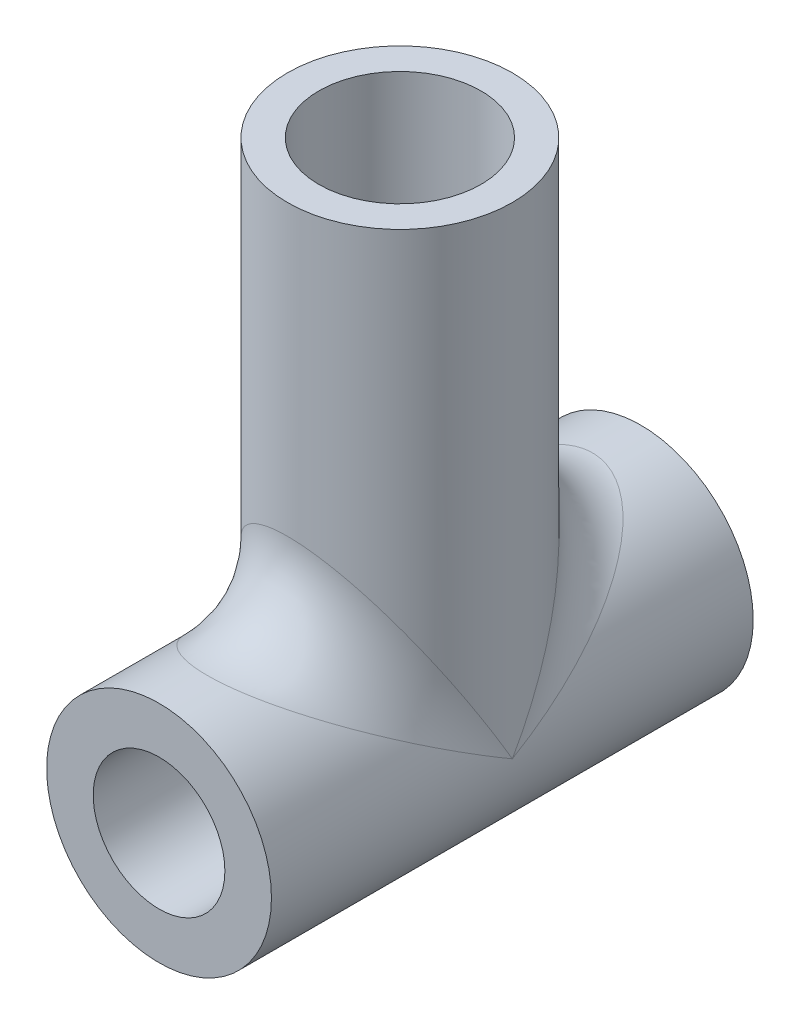
ISO-10303-21;
HEADER;
FILE_DESCRIPTION(('STEP AP214'),'2;1');
FILE_NAME('part.step','',(''),(''),'','','');
FILE_SCHEMA(('AUTOMOTIVE_DESIGN { 1 0 10303 214 1 1 1 1 }'));
ENDSEC;
DATA;
#1=APPLICATION_CONTEXT('core data for automotive mechanical design processes');
#2=APPLICATION_PROTOCOL_DEFINITION('international standard','automotive_design',2000,#1);
#3=PRODUCT_CONTEXT('',#1,'mechanical');
#4=PRODUCT('Part','Part','',(#3));
#5=PRODUCT_RELATED_PRODUCT_CATEGORY('part','',(#4));
#6=PRODUCT_DEFINITION_FORMATION('','',#4);
#7=PRODUCT_DEFINITION_CONTEXT('part definition',#1,'design');
#8=PRODUCT_DEFINITION('design','',#6,#7);
#9=PRODUCT_DEFINITION_SHAPE('','',#8);
#10=(LENGTH_UNIT() NAMED_UNIT(*) SI_UNIT(.MILLI.,.METRE.));
#11=(NAMED_UNIT(*) PLANE_ANGLE_UNIT() SI_UNIT($,.RADIAN.));
#12=(NAMED_UNIT(*) SI_UNIT($,.STERADIAN.) SOLID_ANGLE_UNIT());
#13=UNCERTAINTY_MEASURE_WITH_UNIT(LENGTH_MEASURE(1.E-05),#10,'distance_accuracy_value','');
#14=(GEOMETRIC_REPRESENTATION_CONTEXT(3) GLOBAL_UNCERTAINTY_ASSIGNED_CONTEXT((#13)) GLOBAL_UNIT_ASSIGNED_CONTEXT((#10,
#11,#12)) REPRESENTATION_CONTEXT('',''));
#15=CARTESIAN_POINT('',(0.,0.,0.));
#16=DIRECTION('',(0.,0.,1.));
#17=DIRECTION('',(1.,0.,0.));
#18=AXIS2_PLACEMENT_3D('',#15,#16,#17);
#19=CARTESIAN_POINT('',(0.,0.,30.));
#20=DIRECTION('',(0.,0.,-1.));
#21=DIRECTION('',(-1.,0.,0.));
#22=AXIS2_PLACEMENT_3D('',#19,#20,#21);
#23=CYLINDRICAL_SURFACE('',#22,7.);
#24=CARTESIAN_POINT('',(0.,0.,0.));
#25=DIRECTION('',(0.,0.,1.));
#26=DIRECTION('',(1.,0.,0.));
#27=AXIS2_PLACEMENT_3D('',#24,#25,#26);
#28=CIRCLE('',#27,7.);
#29=CARTESIAN_POINT('',(7.,0.,0.));
#30=VERTEX_POINT('',#29);
#31=EDGE_CURVE('E80',#30,#30,#28,.T.);
#32=ORIENTED_EDGE('',*,*,#31,.T.);
#33=EDGE_LOOP('',(#32));
#34=FACE_BOUND('',#33,.T.);
#35=CARTESIAN_POINT('',(0.,0.,30.));
#36=DIRECTION('',(0.,0.,1.));
#37=DIRECTION('',(1.,0.,0.));
#38=AXIS2_PLACEMENT_3D('',#35,#36,#37);
#39=CIRCLE('',#38,7.);
#40=CARTESIAN_POINT('',(7.,0.,30.));
#41=VERTEX_POINT('',#40);
#42=EDGE_CURVE('E76',#41,#41,#39,.T.);
#43=ORIENTED_EDGE('',*,*,#42,.F.);
#44=EDGE_LOOP('',(#43));
#45=FACE_BOUND('',#44,.T.);
#46=CARTESIAN_POINT('',(0.,0.,15.));
#47=DIRECTION('',(0.,0.863778900898433,0.503871025524086));
#48=DIRECTION('',(0.,-0.503871025524086,0.863778900898433));
#49=AXIS2_PLACEMENT_3D('',#46,#47,#48);
#50=ELLIPSE('',#49,13.8924439894498,7.);
#51=CARTESIAN_POINT('',(-7.,0.,15.));
#52=VERTEX_POINT('',#51);
#53=CARTESIAN_POINT('',(7.,0.,15.));
#54=VERTEX_POINT('',#53);
#55=EDGE_CURVE('E53',#52,#54,#50,.F.);
#56=ORIENTED_EDGE('',*,*,#55,.T.);
#57=CARTESIAN_POINT('',(0.,0.,15.));
#58=DIRECTION('',(0.,0.863778900898433,-0.503871025524086));
#59=DIRECTION('',(0.,-0.503871025524086,-0.863778900898433));
#60=AXIS2_PLACEMENT_3D('',#57,#58,#59);
#61=ELLIPSE('',#60,13.8924439894498,7.);
#62=EDGE_CURVE('E11',#54,#52,#61,.F.);
#63=ORIENTED_EDGE('',*,*,#62,.T.);
#64=EDGE_LOOP('',(#56,#63));
#65=FACE_BOUND('',#64,.T.);
#66=ADVANCED_FACE('F39',(#34,#45,#65),#23,.T.);
#67=CARTESIAN_POINT('',(0.,0.,30.));
#68=DIRECTION('',(0.,0.,1.));
#69=DIRECTION('',(1.,0.,0.));
#70=AXIS2_PLACEMENT_3D('',#67,#68,#69);
#71=PLANE('',#70);
#72=CARTESIAN_POINT('',(0.,0.,30.));
#73=DIRECTION('',(0.,0.,1.));
#74=DIRECTION('',(1.,0.,0.));
#75=AXIS2_PLACEMENT_3D('',#72,#73,#74);
#76=CIRCLE('',#75,4.1);
#77=CARTESIAN_POINT('',(4.1,0.,30.));
#78=VERTEX_POINT('',#77);
#79=EDGE_CURVE('E134',#78,#78,#76,.T.);
#80=ORIENTED_EDGE('',*,*,#79,.F.);
#81=EDGE_LOOP('',(#80));
#82=FACE_BOUND('',#81,.T.);
#83=ORIENTED_EDGE('',*,*,#42,.T.);
#84=EDGE_LOOP('',(#83));
#85=FACE_BOUND('',#84,.T.);
#86=ADVANCED_FACE('F98',(#82,#85),#71,.T.);
#87=CARTESIAN_POINT('',(0.,0.,0.));
#88=DIRECTION('',(0.,0.,1.));
#89=DIRECTION('',(1.,0.,0.));
#90=AXIS2_PLACEMENT_3D('',#87,#88,#89);
#91=PLANE('',#90);
#92=CARTESIAN_POINT('',(0.,0.,0.));
#93=DIRECTION('',(0.,0.,1.));
#94=DIRECTION('',(1.,0.,0.));
#95=AXIS2_PLACEMENT_3D('',#92,#93,#94);
#96=CIRCLE('',#95,4.1);
#97=CARTESIAN_POINT('',(4.1,0.,0.));
#98=VERTEX_POINT('',#97);
#99=EDGE_CURVE('E132',#98,#98,#96,.T.);
#100=ORIENTED_EDGE('',*,*,#99,.T.);
#101=EDGE_LOOP('',(#100));
#102=FACE_BOUND('',#101,.T.);
#103=ORIENTED_EDGE('',*,*,#31,.F.);
#104=EDGE_LOOP('',(#103));
#105=FACE_BOUND('',#104,.T.);
#106=ADVANCED_FACE('F95',(#102,#105),#91,.F.);
#107=CARTESIAN_POINT('',(0.,30.,15.));
#108=DIRECTION('',(0.,-1.,0.));
#109=DIRECTION('',(0.,0.,-1.));
#110=AXIS2_PLACEMENT_3D('',#107,#108,#109);
#111=CYLINDRICAL_SURFACE('',#110,7.);
#112=CARTESIAN_POINT('',(0.,30.,15.));
#113=DIRECTION('',(0.,1.,0.));
#114=DIRECTION('',(0.,0.,1.));
#115=AXIS2_PLACEMENT_3D('',#112,#113,#114);
#116=CIRCLE('',#115,7.);
#117=CARTESIAN_POINT('',(0.,30.,22.));
#118=VERTEX_POINT('',#117);
#119=EDGE_CURVE('E118',#118,#118,#116,.T.);
#120=ORIENTED_EDGE('',*,*,#119,.F.);
#121=EDGE_LOOP('',(#120));
#122=FACE_BOUND('',#121,.T.);
#123=CARTESIAN_POINT('',(0.,0.,15.));
#124=DIRECTION('',(0.,0.503871025524086,0.863778900898433));
#125=DIRECTION('',(0.,-0.863778900898433,0.503871025524086));
#126=AXIS2_PLACEMENT_3D('',#123,#124,#125);
#127=ELLIPSE('',#126,13.8924439894498,7.);
#128=EDGE_CURVE('E72',#54,#52,#127,.T.);
#129=ORIENTED_EDGE('',*,*,#128,.T.);
#130=CARTESIAN_POINT('',(0.,0.,15.));
#131=DIRECTION('',(0.,0.503871025524086,-0.863778900898433));
#132=DIRECTION('',(0.,-0.863778900898433,-0.503871025524086));
#133=AXIS2_PLACEMENT_3D('',#130,#131,#132);
#134=ELLIPSE('',#133,13.8924439894498,7.);
#135=EDGE_CURVE('E65',#52,#54,#134,.T.);
#136=ORIENTED_EDGE('',*,*,#135,.T.);
#137=EDGE_LOOP('',(#129,#136));
#138=FACE_BOUND('',#137,.T.);
#139=ADVANCED_FACE('F71',(#122,#138),#111,.T.);
#140=CARTESIAN_POINT('',(0.,30.,15.));
#141=DIRECTION('',(0.,1.,0.));
#142=DIRECTION('',(0.,0.,1.));
#143=AXIS2_PLACEMENT_3D('',#140,#141,#142);
#144=PLANE('',#143);
#145=CARTESIAN_POINT('',(0.,30.,15.));
#146=DIRECTION('',(0.,1.,0.));
#147=DIRECTION('',(0.,0.,1.));
#148=AXIS2_PLACEMENT_3D('',#145,#146,#147);
#149=CIRCLE('',#148,5.05);
#150=CARTESIAN_POINT('',(0.,30.,20.05));
#151=VERTEX_POINT('',#150);
#152=EDGE_CURVE('E127',#151,#151,#149,.T.);
#153=ORIENTED_EDGE('',*,*,#152,.F.);
#154=EDGE_LOOP('',(#153));
#155=FACE_BOUND('',#154,.T.);
#156=ORIENTED_EDGE('',*,*,#119,.T.);
#157=EDGE_LOOP('',(#156));
#158=FACE_BOUND('',#157,.T.);
#159=ADVANCED_FACE('F94',(#155,#158),#144,.T.);
#160=CARTESIAN_POINT('',(0.,8.,15.));
#161=DIRECTION('',(0.,1.,0.));
#162=DIRECTION('',(0.,0.,1.));
#163=AXIS2_PLACEMENT_3D('',#160,#161,#162);
#164=CYLINDRICAL_SURFACE('',#163,5.05);
#165=CARTESIAN_POINT('',(0.,8.,15.));
#166=DIRECTION('',(0.,1.,0.));
#167=DIRECTION('',(0.,0.,1.));
#168=AXIS2_PLACEMENT_3D('',#165,#166,#167);
#169=CIRCLE('',#168,5.05);
#170=CARTESIAN_POINT('',(0.,8.,20.05));
#171=VERTEX_POINT('',#170);
#172=EDGE_CURVE('E121',#171,#171,#169,.T.);
#173=ORIENTED_EDGE('',*,*,#172,.F.);
#174=EDGE_LOOP('',(#173));
#175=FACE_BOUND('',#174,.T.);
#176=ORIENTED_EDGE('',*,*,#152,.T.);
#177=EDGE_LOOP('',(#176));
#178=FACE_BOUND('',#177,.T.);
#179=ADVANCED_FACE('F149',(#175,#178),#164,.F.);
#180=CARTESIAN_POINT('',(0.,8.,15.));
#181=DIRECTION('',(0.,1.,0.));
#182=DIRECTION('',(0.,0.,1.));
#183=AXIS2_PLACEMENT_3D('',#180,#181,#182);
#184=PLANE('',#183);
#185=ORIENTED_EDGE('',*,*,#172,.T.);
#186=EDGE_LOOP('',(#185));
#187=FACE_BOUND('',#186,.T.);
#188=ADVANCED_FACE('F143',(#187),#184,.T.);
#189=CARTESIAN_POINT('',(0.,0.,0.));
#190=DIRECTION('',(0.,0.,1.));
#191=DIRECTION('',(1.,0.,0.));
#192=AXIS2_PLACEMENT_3D('',#189,#190,#191);
#193=CYLINDRICAL_SURFACE('',#192,4.1);
#194=ORIENTED_EDGE('',*,*,#99,.F.);
#195=EDGE_LOOP('',(#194));
#196=FACE_BOUND('',#195,.T.);
#197=ORIENTED_EDGE('',*,*,#79,.T.);
#198=EDGE_LOOP('',(#197));
#199=FACE_BOUND('',#198,.T.);
#200=ADVANCED_FACE('F87',(#196,#199),#193,.F.);
#201=CARTESIAN_POINT('',(7.,0.,15.));
#202=CARTESIAN_POINT('',(6.99999999999999,0.,15.));
#203=CARTESIAN_POINT('',(7.,0.,15.));
#204=CARTESIAN_POINT('',(6.99999121671173,0.152507156184433,15.2614408391733));
#205=CARTESIAN_POINT('',(7.00002568373421,0.206973635544794,15.2069736355447));
#206=CARTESIAN_POINT('',(6.99999121671173,0.26144083917334,15.1525071561844));
#207=CARTESIAN_POINT('',(6.99501618814987,0.304992315298513,15.5228439690831));
#208=CARTESIAN_POINT('',(6.99144768642064,0.414064677169837,15.4140646771698));
#209=CARTESIAN_POINT('',(6.99501618814987,0.522843969083195,15.3049923152985));
#210=CARTESIAN_POINT('',(6.97507447764639,0.609647938849697,16.0451107523137));
#211=CARTESIAN_POINT('',(6.95727769866295,0.826828213524044,15.826828213524));
#212=CARTESIAN_POINT('',(6.97507447764639,1.04511075231379,15.6096479388497));
#213=CARTESIAN_POINT('',(6.96010696220212,0.761818375972701,16.3059743588103));
#214=CARTESIAN_POINT('',(6.93163564044578,1.03279285488625,16.0327928548862));
#215=CARTESIAN_POINT('',(6.96010696220211,1.30597435881035,15.7618183759727));
#216=CARTESIAN_POINT('',(6.90048035637649,1.21473805848717,17.0824081002637));
#217=CARTESIAN_POINT('',(6.82960943420147,1.64413006224257,16.6441300622426));
#218=CARTESIAN_POINT('',(6.90048035637648,2.0824081002637,16.2147380584872));
#219=CARTESIAN_POINT('',(6.84109756250271,1.51459233066843,17.5964439954316));
#220=CARTESIAN_POINT('',(6.72779723667562,2.04660139397045,17.0466013939705));
#221=CARTESIAN_POINT('',(6.8410975625027,2.5964439954316,16.5145923306684));
#222=CARTESIAN_POINT('',(6.68319941414075,2.10389036856832,18.60666920326));
#223=CARTESIAN_POINT('',(6.46118137855605,2.82392092414324,17.8239209241432));
#224=CARTESIAN_POINT('',(6.68319941414075,3.60666920325998,17.1038903685683));
#225=CARTESIAN_POINT('',(6.58535713458826,2.39342439063523,19.103013241089));
#226=CARTESIAN_POINT('',(6.29598987161912,3.20108723741113,18.2010872374111));
#227=CARTESIAN_POINT('',(6.58535713458825,4.10301324108896,17.3934243906352));
#228=CARTESIAN_POINT('',(6.35186811595102,2.95711400081162,20.0693382871056));
#229=CARTESIAN_POINT('',(5.90998492766348,3.91574935643684,18.9157493564368));
#230=CARTESIAN_POINT('',(6.35186811595101,5.06933828710563,17.9571140008116));
#231=CARTESIAN_POINT('',(6.21721204272844,3.23147272262579,20.5396675245014));
#232=CARTESIAN_POINT('',(5.68859612985308,4.25548875426844,19.2554887542684));
#233=CARTESIAN_POINT('',(6.21721204272843,5.53966752450136,18.2314727226258));
#234=CARTESIAN_POINT('',(5.91207835949009,3.75998003658355,21.4456800627146));
#235=CARTESIAN_POINT('',(5.20120692093714,4.88398143428298,19.883981434283));
#236=CARTESIAN_POINT('',(5.91207835949009,6.44568006271465,18.7599800365836));
#237=CARTESIAN_POINT('',(5.74287737854464,4.01449395109674,21.8819896304515));
#238=CARTESIAN_POINT('',(4.93446890750515,5.17484438858528,20.1748443885853));
#239=CARTESIAN_POINT('',(5.74287737854463,6.8819896304515,19.0144939510967));
#240=CARTESIAN_POINT('',(5.37126551204024,4.49878788197021,22.7122077976633));
#241=CARTESIAN_POINT('',(4.37171373632647,5.69598508355168,20.6959850835517));
#242=CARTESIAN_POINT('',(5.37126551204024,7.71220779766327,19.4987878819702));
#243=CARTESIAN_POINT('',(5.17036063103307,4.72914023348076,23.10709754311));
#244=CARTESIAN_POINT('',(4.07485694126246,5.9281576183475,20.9281576183475));
#245=CARTESIAN_POINT('',(5.17036063103307,8.10709754311004,19.7291402334808));
#246=CARTESIAN_POINT('',(4.7385328939594,5.1609563672913,23.8473537724992));
#247=CARTESIAN_POINT('',(3.47197474466876,6.32548689216347,21.3254868921635));
#248=CARTESIAN_POINT('',(4.7385328939594,8.8473537724992,20.1609563672913));
#249=CARTESIAN_POINT('',(4.50925349768859,5.36323278803965,24.1941133509245));
#250=CARTESIAN_POINT('',(3.16511722736772,6.49223435553789,21.4922343555379));
#251=CARTESIAN_POINT('',(4.50925349768859,9.19411335092452,20.3632327880397));
#252=CARTESIAN_POINT('',(4.02455018659784,5.73516303189859,24.8317080546839));
#253=CARTESIAN_POINT('',(2.56651938800386,6.75781641350634,21.7578164135063));
#254=CARTESIAN_POINT('',(4.02455018659784,9.83170805468386,20.7351630318986));
#255=CARTESIAN_POINT('',(3.77076463640556,5.90587451263537,25.124356307377));
#256=CARTESIAN_POINT('',(2.27411762563465,6.8578636695983,21.8578636695983));
#257=CARTESIAN_POINT('',(3.77076463640555,10.124356307377,20.9058745126354));
#258=CARTESIAN_POINT('',(3.24119344694015,6.21157814119922,25.6484196706252));
#259=CARTESIAN_POINT('',(1.72994171137987,6.99750115059274,21.9975011505927));
#260=CARTESIAN_POINT('',(3.24119344694014,10.6484196706252,21.2115781411992));
#261=CARTESIAN_POINT('',(2.96687442345336,6.3478148345062,25.8819682877177));
#262=CARTESIAN_POINT('',(1.47784832893888,7.03790856640037,22.0379085664004));
#263=CARTESIAN_POINT('',(2.96687442345336,10.8819682877177,21.3478148345062));
#264=CARTESIAN_POINT('',(2.54025494045971,6.52454261603055,26.184930198913));
#265=CARTESIAN_POINT('',(1.14446342953702,7.06672093085115,22.0667209308512));
#266=CARTESIAN_POINT('',(2.54025494045971,11.184930198913,21.5245426160305));
#267=CARTESIAN_POINT('',(2.39854164490027,6.57802209796876,26.2766093108134));
#268=CARTESIAN_POINT('',(1.04174687131263,7.07111091747496,22.071110917475));
#269=CARTESIAN_POINT('',(2.39854164490027,11.2766093108134,21.5780220979688));
#270=CARTESIAN_POINT('',(2.10929959814391,6.67638725753668,26.4452352986433));
#271=CARTESIAN_POINT('',(0.849988565968583,7.07265552979389,22.0726555297939));
#272=CARTESIAN_POINT('',(2.10929959814391,11.4452352986433,21.6763872575367));
#273=CARTESIAN_POINT('',(1.96177369987319,6.7212770892842,26.5221892959176));
#274=CARTESIAN_POINT('',(0.761262199215204,7.06972424789233,22.0697242478923));
#275=CARTESIAN_POINT('',(1.96177369987319,11.5221892959176,21.7212770892842));
#276=CARTESIAN_POINT('',(1.66614295579844,6.80049208368201,26.6579864291674));
#277=CARTESIAN_POINT('',(0.600591803470876,7.05976112109474,22.0597611210947));
#278=CARTESIAN_POINT('',(1.66614295579844,11.6579864291674,21.800492083682));
#279=CARTESIAN_POINT('',(1.51818505161996,6.83509109499208,26.7172990199879));
#280=CARTESIAN_POINT('',(0.528502499356465,7.05282034418533,22.0528203441853));
#281=CARTESIAN_POINT('',(1.51818505161996,11.7172990199879,21.8350910949921));
#282=CARTESIAN_POINT('',(1.21848462757332,6.89482656928182,26.8197026902001));
#283=CARTESIAN_POINT('',(0.396761079941371,7.03798411921859,22.0379841192186));
#284=CARTESIAN_POINT('',(1.21848462757332,11.8197026902001,21.8948265692818));
#285=CARTESIAN_POINT('',(1.06674227762967,6.9199634563054,26.8627944965241));
#286=CARTESIAN_POINT('',(0.337365547459925,7.0300985450055,22.0300985450055));
#287=CARTESIAN_POINT('',(1.06674227762967,11.8627944965241,21.9199634563054));
#288=CARTESIAN_POINT('',(0.763120646237779,6.9599359679304,26.9313188021658));
#289=CARTESIAN_POINT('',(0.229058918336639,7.01628835912518,22.0162883591252));
#290=CARTESIAN_POINT('',(0.763120646237778,11.9313188021658,21.9599359679304));
#291=CARTESIAN_POINT('',(0.611283958786551,6.97493290949336,26.957027844846));
#292=CARTESIAN_POINT('',(0.180181199355022,7.01036129285114,22.0103612928511));
#293=CARTESIAN_POINT('',(0.61128395878655,11.957027844846,21.9749329094934));
#294=CARTESIAN_POINT('',(0.306298165295676,6.9949648369347,26.9913682918886));
#295=CARTESIAN_POINT('',(0.0874601589115753,7.0022061370351,22.0022061370351));
#296=CARTESIAN_POINT('',(0.306298165295675,11.9913682918886,21.9949648369347));
#297=CARTESIAN_POINT('',(0.153149082647838,7.,27.));
#298=CARTESIAN_POINT('',(0.0437616029125144,7.,22.));
#299=CARTESIAN_POINT('',(0.153149082647837,12.,22.));
#300=CARTESIAN_POINT('',(-0.153149082647838,7.,27.));
#301=CARTESIAN_POINT('',(-0.0437616029125174,7.,22.));
#302=CARTESIAN_POINT('',(-0.15314908264784,12.,22.));
#303=CARTESIAN_POINT('',(-0.306298165295677,6.9949648369347,26.9913682918886));
#304=CARTESIAN_POINT('',(-0.0874601589115785,7.0022061370351,22.0022061370351));
#305=CARTESIAN_POINT('',(-0.306298165295678,11.9913682918886,21.9949648369347));
#306=CARTESIAN_POINT('',(-0.611283958786552,6.97493290949336,26.957027844846));
#307=CARTESIAN_POINT('',(-0.180181199355026,7.01036129285114,22.0103612928511));
#308=CARTESIAN_POINT('',(-0.611283958786553,11.957027844846,21.9749329094934));
#309=CARTESIAN_POINT('',(-0.76312064623778,6.9599359679304,26.9313188021658));
#310=CARTESIAN_POINT('',(-0.229058918336641,7.01628835912518,22.0162883591252));
#311=CARTESIAN_POINT('',(-0.763120646237781,11.9313188021658,21.9599359679304));
#312=CARTESIAN_POINT('',(-1.06674227762967,6.9199634563054,26.8627944965241));
#313=CARTESIAN_POINT('',(-0.337365547459927,7.0300985450055,22.0300985450055));
#314=CARTESIAN_POINT('',(-1.06674227762967,11.8627944965241,21.9199634563054));
#315=CARTESIAN_POINT('',(-1.21848462757332,6.89482656928182,26.8197026902001));
#316=CARTESIAN_POINT('',(-0.396761079941374,7.03798411921859,22.0379841192186));
#317=CARTESIAN_POINT('',(-1.21848462757332,11.8197026902001,21.8948265692818));
#318=CARTESIAN_POINT('',(-1.51818505161996,6.83509109499208,26.7172990199879));
#319=CARTESIAN_POINT('',(-0.528502499356468,7.05282034418533,22.0528203441853));
#320=CARTESIAN_POINT('',(-1.51818505161996,11.7172990199879,21.8350910949921));
#321=CARTESIAN_POINT('',(-1.66614295579844,6.80049208368202,26.6579864291674));
#322=CARTESIAN_POINT('',(-0.600591803470879,7.05976112109474,22.0597611210947));
#323=CARTESIAN_POINT('',(-1.66614295579844,11.6579864291674,21.800492083682));
#324=CARTESIAN_POINT('',(-1.96177369987319,6.7212770892842,26.5221892959176));
#325=CARTESIAN_POINT('',(-0.761262199215206,7.06972424789234,22.0697242478923));
#326=CARTESIAN_POINT('',(-1.96177369987319,11.5221892959176,21.7212770892842));
#327=CARTESIAN_POINT('',(-2.10929959814391,6.67638725753668,26.4452352986433));
#328=CARTESIAN_POINT('',(-0.849988565968585,7.07265552979389,22.0726555297939));
#329=CARTESIAN_POINT('',(-2.10929959814391,11.4452352986433,21.6763872575367));
#330=CARTESIAN_POINT('',(-2.39854164490027,6.57802209796876,26.2766093108134));
#331=CARTESIAN_POINT('',(-1.04174687131263,7.07111091747495,22.071110917475));
#332=CARTESIAN_POINT('',(-2.39854164490027,11.2766093108134,21.5780220979688));
#333=CARTESIAN_POINT('',(-2.54025494045971,6.52454261603055,26.184930198913));
#334=CARTESIAN_POINT('',(-1.14446342953703,7.06672093085116,22.0667209308512));
#335=CARTESIAN_POINT('',(-2.54025494045971,11.184930198913,21.5245426160305));
#336=CARTESIAN_POINT('',(-2.96687442345336,6.3478148345062,25.8819682877177));
#337=CARTESIAN_POINT('',(-1.47784832893888,7.03790856640037,22.0379085664004));
#338=CARTESIAN_POINT('',(-2.96687442345336,10.8819682877177,21.3478148345062));
#339=CARTESIAN_POINT('',(-3.24119344694015,6.21157814119922,25.6484196706252));
#340=CARTESIAN_POINT('',(-1.72994171137987,6.99750115059274,21.9975011505927));
#341=CARTESIAN_POINT('',(-3.24119344694015,10.6484196706252,21.2115781411992));
#342=CARTESIAN_POINT('',(-3.77076463640556,5.90587451263537,25.124356307377));
#343=CARTESIAN_POINT('',(-2.27411762563465,6.8578636695983,21.8578636695983));
#344=CARTESIAN_POINT('',(-3.77076463640556,10.124356307377,20.9058745126354));
#345=CARTESIAN_POINT('',(-4.02455018659784,5.73516303189859,24.8317080546839));
#346=CARTESIAN_POINT('',(-2.56651938800386,6.75781641350634,21.7578164135063));
#347=CARTESIAN_POINT('',(-4.02455018659785,9.83170805468386,20.7351630318986));
#348=CARTESIAN_POINT('',(-4.50925349768859,5.36323278803965,24.1941133509245));
#349=CARTESIAN_POINT('',(-3.16511722736772,6.4922343555379,21.4922343555379));
#350=CARTESIAN_POINT('',(-4.50925349768859,9.19411335092452,20.3632327880397));
#351=CARTESIAN_POINT('',(-4.7385328939594,5.1609563672913,23.8473537724992));
#352=CARTESIAN_POINT('',(-3.47197474466876,6.32548689216347,21.3254868921635));
#353=CARTESIAN_POINT('',(-4.73853289395941,8.84735377249921,20.1609563672913));
#354=CARTESIAN_POINT('',(-5.17036063103307,4.72914023348076,23.10709754311));
#355=CARTESIAN_POINT('',(-4.07485694126246,5.92815761834751,20.9281576183475));
#356=CARTESIAN_POINT('',(-5.17036063103307,8.10709754311004,19.7291402334808));
#357=CARTESIAN_POINT('',(-5.37126551204024,4.49878788197021,22.7122077976633));
#358=CARTESIAN_POINT('',(-4.37171373632647,5.69598508355169,20.6959850835517));
#359=CARTESIAN_POINT('',(-5.37126551204024,7.71220779766327,19.4987878819702));
#360=CARTESIAN_POINT('',(-5.74287737854464,4.01449395109674,21.8819896304515));
#361=CARTESIAN_POINT('',(-4.93446890750515,5.17484438858528,20.1748443885853));
#362=CARTESIAN_POINT('',(-5.74287737854464,6.88198963045151,19.0144939510967));
#363=CARTESIAN_POINT('',(-5.91207835949009,3.75998003658356,21.4456800627147));
#364=CARTESIAN_POINT('',(-5.20120692093714,4.88398143428298,19.883981434283));
#365=CARTESIAN_POINT('',(-5.91207835949009,6.44568006271465,18.7599800365836));
#366=CARTESIAN_POINT('',(-6.21721204272844,3.23147272262579,20.5396675245014));
#367=CARTESIAN_POINT('',(-5.68859612985308,4.25548875426844,19.2554887542684));
#368=CARTESIAN_POINT('',(-6.21721204272844,5.53966752450137,18.2314727226258));
#369=CARTESIAN_POINT('',(-6.35186811595102,2.95711400081162,20.0693382871056));
#370=CARTESIAN_POINT('',(-5.90998492766348,3.91574935643685,18.9157493564368));
#371=CARTESIAN_POINT('',(-6.35186811595102,5.06933828710564,17.9571140008116));
#372=CARTESIAN_POINT('',(-6.58535713458826,2.39342439063523,19.103013241089));
#373=CARTESIAN_POINT('',(-6.29598987161912,3.20108723741113,18.2010872374111));
#374=CARTESIAN_POINT('',(-6.58535713458826,4.10301324108896,17.3934243906352));
#375=CARTESIAN_POINT('',(-6.68319941414075,2.10389036856831,18.60666920326));
#376=CARTESIAN_POINT('',(-6.46118137855605,2.82392092414323,17.8239209241432));
#377=CARTESIAN_POINT('',(-6.68319941414075,3.60666920325997,17.1038903685683));
#378=CARTESIAN_POINT('',(-6.84109756250271,1.51459233066844,17.5964439954316));
#379=CARTESIAN_POINT('',(-6.72779723667563,2.04660139397046,17.0466013939705));
#380=CARTESIAN_POINT('',(-6.84109756250271,2.59644399543161,16.5145923306684));
#381=CARTESIAN_POINT('',(-6.90048035637649,1.21473805848719,17.0824081002637));
#382=CARTESIAN_POINT('',(-6.82960943420147,1.6441300622426,16.6441300622426));
#383=CARTESIAN_POINT('',(-6.90048035637649,2.08240810026374,16.2147380584872));
#384=CARTESIAN_POINT('',(-6.96010696220212,0.761818375972689,16.3059743588103));
#385=CARTESIAN_POINT('',(-6.93163564044578,1.03279285488623,16.0327928548862));
#386=CARTESIAN_POINT('',(-6.96010696220212,1.30597435881033,15.7618183759727));
#387=CARTESIAN_POINT('',(-6.97507447764639,0.609647938849665,16.0451107523138));
#388=CARTESIAN_POINT('',(-6.95727769866295,0.826828213524001,15.826828213524));
#389=CARTESIAN_POINT('',(-6.97507447764639,1.04511075231373,15.6096479388497));
#390=CARTESIAN_POINT('',(-6.99501618814987,0.304992315298467,15.5228439690832));
#391=CARTESIAN_POINT('',(-6.99144768642065,0.414064677169776,15.4140646771698));
#392=CARTESIAN_POINT('',(-6.99501618814987,0.522843969083116,15.3049923152985));
#393=CARTESIAN_POINT('',(-6.99999121671173,0.152507156184394,15.2614408391733));
#394=CARTESIAN_POINT('',(-7.00002568373422,0.206973635544741,15.2069736355448));
#395=CARTESIAN_POINT('',(-6.99999121671173,0.261440839173273,15.1525071561844));
#396=CARTESIAN_POINT('',(-7.,0.,15.));
#397=CARTESIAN_POINT('',(-7.,0.,15.));
#398=CARTESIAN_POINT('',(-7.,0.,15.));
#399=(BOUNDED_SURFACE() B_SPLINE_SURFACE(3,2,((#201,#202,#203),(#204,#205,#206),(#207,#208,
#209),(#210,#211,#212),(#213,#214,#215),(#216,#217,#218),(#219,#220,#221),(#222,#223,#224),
(#225,#226,#227),(#228,#229,#230),(#231,#232,#233),(#234,#235,#236),(#237,#238,#239),(#240,#241,
#242),(#243,#244,#245),(#246,#247,#248),(#249,#250,#251),(#252,#253,#254),(#255,#256,#257),
(#258,#259,#260),(#261,#262,#263),(#264,#265,#266),(#267,#268,#269),(#270,#271,#272),(#273,#274,
#275),(#276,#277,#278),(#279,#280,#281),(#282,#283,#284),(#285,#286,#287),(#288,#289,#290),
(#291,#292,#293),(#294,#295,#296),(#297,#298,#299),(#300,#301,#302),(#303,#304,#305),(#306,#307,
#308),(#309,#310,#311),(#312,#313,#314),(#315,#316,#317),(#318,#319,#320),(#321,#322,#323),
(#324,#325,#326),(#327,#328,#329),(#330,#331,#332),(#333,#334,#335),(#336,#337,#338),(#339,#340,
#341),(#342,#343,#344),(#345,#346,#347),(#348,#349,#350),(#351,#352,#353),(#354,#355,#356),
(#357,#358,#359),(#360,#361,#362),(#363,#364,#365),(#366,#367,#368),(#369,#370,#371),(#372,#373,
#374),(#375,#376,#377),(#378,#379,#380),(#381,#382,#383),(#384,#385,#386),(#387,#388,#389),
(#390,#391,#392),(#393,#394,#395),(#396,#397,#398)),.UNSPECIFIED.,.F.,.F.,
.F.) B_SPLINE_SURFACE_WITH_KNOTS((4,2,2,2,2,2,2,2,2,2,2,2,2,2,2,2,2,2,2,2,2,2,2,2,2,2,2,2,2,2,2,
2,4),(3,3),(0.,1.1089923560654,2.21807722799634,4.41670953078066,6.57846427416409,
8.68696549975972,10.728352993526,12.6921809693986,14.5723457106401,16.3680007090523,
18.0843521750083,18.9096646552528,19.7345769843153,20.5350233679069,21.3354338753221,
22.1227905156799,22.9101331514558,23.6974757872317,24.4848324275894,25.2852429350046,
26.0856893185962,26.9106016476587,27.7359141279032,29.4522655938593,31.2479205922714,
33.128085333513,35.0919133093856,37.1333008031518,39.2418020287475,41.4035567721309,
43.6021890749152,44.7112739468461,45.8202663029115),(0.,1.),
.UNSPECIFIED.) GEOMETRIC_REPRESENTATION_ITEM() RATIONAL_B_SPLINE_SURFACE(((1.,1.,1.),(1.,
0.999999961347463,1.),(1.,0.999643922983415,1.),(1.,0.998220838244432,1.),(1.,0.9971537325573,
1.),(1.,0.992912442828985,1.),(1.,0.988698139291655,1.),(1.,0.977616678491385,1.),(1.,
0.97079520304151,1.),(1.,0.954789243872577,1.),(1.,0.945667111065233,1.),(1.,0.925487928481846,
1.),(1.,0.914501709356166,1.),(1.,0.891170043426741,1.),(1.,0.878892097180268,1.),(1.,
0.853706858801671,1.),(1.,0.840848661881578,1.),(1.,0.815387916751879,1.),(1.,0.802799855398148,
1.),(1.,0.778879121387154,1.),(1.,0.767515558221761,1.),(1.,0.752114039499013,1.),(1.,
0.747335652339599,1.),(1.,0.738380805978003,1.),(1.,0.734204056055491,1.),(1.,0.726721566717485,
1.),(1.,0.723393668203355,1.),(1.,0.717585877218612,1.),(1.,0.715105946746874,1.),(1.,
0.711136411789176,1.),(1.,0.709631315728964,1.),(1.,0.707616509279792,1.),(1.,0.707106781186548,
1.),(1.,0.707106781186548,1.),(1.,0.707616509279792,1.),(1.,0.709631315728964,1.),(1.,
0.711136411789176,1.),(1.,0.715105946746874,1.),(1.,0.717585877218612,1.),(1.,0.723393668203355,
1.),(1.,0.726721566717485,1.),(1.,0.734204056055491,1.),(1.,0.738380805978003,1.),(1.,
0.747335652339599,1.),(1.,0.752114039499013,1.),(1.,0.767515558221761,1.),(1.,0.778879121387154,
1.),(1.,0.802799855398147,1.),(1.,0.815387916751879,1.),(1.,0.840848661881577,1.),(1.,
0.853706858801671,1.),(1.,0.878892097180268,1.),(1.,0.891170043426741,1.),(1.,0.914501709356166,
1.),(1.,0.925487928481845,1.),(1.,0.945667111065232,1.),(1.,0.954789243872577,1.),(1.,
0.97079520304151,1.),(1.,0.977616678491385,1.),(1.,0.988698139291655,1.),(1.,0.992912442828985,
1.),(1.,0.9971537325573,1.),(1.,0.998220838244432,1.),(1.,0.999643922983415,1.),(1.,
0.999999961347463,1.),(1.,1.,1.))) REPRESENTATION_ITEM('') SURFACE());
#400=ORIENTED_EDGE('',*,*,#135,.F.);
#401=ORIENTED_EDGE('',*,*,#62,.F.);
#402=EDGE_LOOP('',(#400,#401));
#403=FACE_BOUND('',#402,.T.);
#404=ADVANCED_FACE('F63',(#403),#399,.F.);
#405=CARTESIAN_POINT('',(-7.,0.,15.));
#406=CARTESIAN_POINT('',(-7.,0.,15.));
#407=CARTESIAN_POINT('',(-7.,0.,15.));
#408=CARTESIAN_POINT('',(-6.99999121671173,0.152507156184393,14.7385591608267));
#409=CARTESIAN_POINT('',(-7.00002568373422,0.206973635544739,14.7930263644552));
#410=CARTESIAN_POINT('',(-6.99999121671173,0.261440839173271,14.8474928438156));
#411=CARTESIAN_POINT('',(-6.99501618814987,0.304992315298467,14.4771560309168));
#412=CARTESIAN_POINT('',(-6.99144768642065,0.414064677169776,14.5859353228302));
#413=CARTESIAN_POINT('',(-6.99501618814987,0.522843969083116,14.6950076847015));
#414=CARTESIAN_POINT('',(-6.97507447764639,0.609647938849666,13.9548892476862));
#415=CARTESIAN_POINT('',(-6.95727769866295,0.826828213524002,14.173171786476));
#416=CARTESIAN_POINT('',(-6.97507447764639,1.04511075231373,14.3903520611503));
#417=CARTESIAN_POINT('',(-6.96010696220212,0.76181837597269,13.6940256411897));
#418=CARTESIAN_POINT('',(-6.93163564044578,1.03279285488623,13.9672071451138));
#419=CARTESIAN_POINT('',(-6.96010696220212,1.30597435881033,14.2381816240273));
#420=CARTESIAN_POINT('',(-6.90048035637649,1.21473805848719,12.9175918997363));
#421=CARTESIAN_POINT('',(-6.82960943420147,1.6441300622426,13.3558699377574));
#422=CARTESIAN_POINT('',(-6.90048035637649,2.08240810026374,13.7852619415128));
#423=CARTESIAN_POINT('',(-6.84109756250271,1.51459233066844,12.4035560045684));
#424=CARTESIAN_POINT('',(-6.72779723667563,2.04660139397046,12.9533986060295));
#425=CARTESIAN_POINT('',(-6.84109756250271,2.59644399543161,13.4854076693316));
#426=CARTESIAN_POINT('',(-6.68319941414075,2.10389036856831,11.39333079674));
#427=CARTESIAN_POINT('',(-6.46118137855605,2.82392092414323,12.1760790758568));
#428=CARTESIAN_POINT('',(-6.68319941414075,3.60666920325997,12.8961096314317));
#429=CARTESIAN_POINT('',(-6.58535713458826,2.39342439063523,10.896986758911));
#430=CARTESIAN_POINT('',(-6.29598987161912,3.20108723741113,11.7989127625889));
#431=CARTESIAN_POINT('',(-6.58535713458826,4.10301324108896,12.6065756093648));
#432=CARTESIAN_POINT('',(-6.35186811595102,2.95711400081162,9.93066171289437));
#433=CARTESIAN_POINT('',(-5.90998492766348,3.91574935643684,11.0842506435632));
#434=CARTESIAN_POINT('',(-6.35186811595102,5.06933828710564,12.0428859991884));
#435=CARTESIAN_POINT('',(-6.21721204272844,3.23147272262579,9.46033247549864));
#436=CARTESIAN_POINT('',(-5.68859612985308,4.25548875426844,10.7445112457316));
#437=CARTESIAN_POINT('',(-6.21721204272844,5.53966752450136,11.7685272773742));
#438=CARTESIAN_POINT('',(-5.91207835949009,3.75998003658355,8.55431993728535));
#439=CARTESIAN_POINT('',(-5.20120692093715,4.88398143428298,10.116018565717));
#440=CARTESIAN_POINT('',(-5.91207835949009,6.44568006271465,11.2400199634164));
#441=CARTESIAN_POINT('',(-5.74287737854464,4.01449395109674,8.11801036954849));
#442=CARTESIAN_POINT('',(-4.93446890750516,5.17484438858528,9.82515561141472));
#443=CARTESIAN_POINT('',(-5.74287737854464,6.8819896304515,10.9855060489033));
#444=CARTESIAN_POINT('',(-5.37126551204024,4.49878788197021,7.28779220233673));
#445=CARTESIAN_POINT('',(-4.37171373632648,5.69598508355169,9.30401491644832));
#446=CARTESIAN_POINT('',(-5.37126551204024,7.71220779766327,10.5012121180298));
#447=CARTESIAN_POINT('',(-5.17036063103307,4.72914023348076,6.89290245688996));
#448=CARTESIAN_POINT('',(-4.07485694126246,5.9281576183475,9.0718423816525));
#449=CARTESIAN_POINT('',(-5.17036063103307,8.10709754311004,10.2708597665192));
#450=CARTESIAN_POINT('',(-4.73853289395941,5.1609563672913,6.1526462275008));
#451=CARTESIAN_POINT('',(-3.47197474466876,6.32548689216347,8.67451310783653));
#452=CARTESIAN_POINT('',(-4.73853289395941,8.8473537724992,9.8390436327087));
#453=CARTESIAN_POINT('',(-4.50925349768859,5.36323278803965,5.80588664907548));
#454=CARTESIAN_POINT('',(-3.16511722736773,6.4922343555379,8.5077656444621));
#455=CARTESIAN_POINT('',(-4.5092534976886,9.19411335092452,9.63676721196035));
#456=CARTESIAN_POINT('',(-4.02455018659785,5.73516303189859,5.16829194531614));
#457=CARTESIAN_POINT('',(-2.56651938800386,6.75781641350634,8.24218358649366));
#458=CARTESIAN_POINT('',(-4.02455018659785,9.83170805468386,9.26483696810141));
#459=CARTESIAN_POINT('',(-3.77076463640556,5.90587451263537,4.87564369262301));
#460=CARTESIAN_POINT('',(-2.27411762563466,6.8578636695983,8.1421363304017));
#461=CARTESIAN_POINT('',(-3.77076463640556,10.124356307377,9.09412548736463));
#462=CARTESIAN_POINT('',(-3.24119344694015,6.21157814119921,4.35158032937475));
#463=CARTESIAN_POINT('',(-1.72994171137987,6.99750115059274,8.00249884940726));
#464=CARTESIAN_POINT('',(-3.24119344694015,10.6484196706252,8.78842185880078));
#465=CARTESIAN_POINT('',(-2.96687442345336,6.3478148345062,4.11803171228231));
#466=CARTESIAN_POINT('',(-1.47784832893889,7.03790856640037,7.96209143359962));
#467=CARTESIAN_POINT('',(-2.96687442345336,10.8819682877177,8.6521851654938));
#468=CARTESIAN_POINT('',(-2.54025494045971,6.52454261603055,3.81506980108702));
#469=CARTESIAN_POINT('',(-1.14446342953703,7.06672093085115,7.93327906914885));
#470=CARTESIAN_POINT('',(-2.54025494045971,11.184930198913,8.47545738396945));
#471=CARTESIAN_POINT('',(-2.39854164490027,6.57802209796876,3.72339068918659));
#472=CARTESIAN_POINT('',(-1.04174687131263,7.07111091747496,7.92888908252505));
#473=CARTESIAN_POINT('',(-2.39854164490027,11.2766093108134,8.42197790203124));
#474=CARTESIAN_POINT('',(-2.10929959814391,6.67638725753668,3.55476470135668));
#475=CARTESIAN_POINT('',(-0.849988565968586,7.07265552979389,7.92734447020611));
#476=CARTESIAN_POINT('',(-2.10929959814391,11.4452352986433,8.32361274246332));
#477=CARTESIAN_POINT('',(-1.96177369987319,6.7212770892842,3.47781070408241));
#478=CARTESIAN_POINT('',(-0.761262199215207,7.06972424789233,7.93027575210767));
#479=CARTESIAN_POINT('',(-1.96177369987319,11.5221892959176,8.2787229107158));
#480=CARTESIAN_POINT('',(-1.66614295579844,6.80049208368201,3.34201357083261));
#481=CARTESIAN_POINT('',(-0.60059180347088,7.05976112109474,7.94023887890526));
#482=CARTESIAN_POINT('',(-1.66614295579844,11.6579864291674,8.19950791631798));
#483=CARTESIAN_POINT('',(-1.51818505161996,6.83509109499208,3.2827009800121));
#484=CARTESIAN_POINT('',(-0.528502499356469,7.05282034418533,7.94717965581467));
#485=CARTESIAN_POINT('',(-1.51818505161996,11.7172990199879,8.16490890500792));
#486=CARTESIAN_POINT('',(-1.21848462757332,6.89482656928182,3.18029730979995));
#487=CARTESIAN_POINT('',(-0.396761079941375,7.03798411921859,7.96201588078141));
#488=CARTESIAN_POINT('',(-1.21848462757333,11.8197026902001,8.10517343071818));
#489=CARTESIAN_POINT('',(-1.06674227762967,6.9199634563054,3.13720550347587));
#490=CARTESIAN_POINT('',(-0.337365547459929,7.0300985450055,7.9699014549945));
#491=CARTESIAN_POINT('',(-1.06674227762967,11.8627944965241,8.0800365436946));
#492=CARTESIAN_POINT('',(-0.763120646237781,6.9599359679304,3.06868119783417));
#493=CARTESIAN_POINT('',(-0.229058918336642,7.01628835912518,7.98371164087482));
#494=CARTESIAN_POINT('',(-0.763120646237783,11.9313188021658,8.0400640320696));
#495=CARTESIAN_POINT('',(-0.611283958786553,6.97493290949336,3.04297215515395));
#496=CARTESIAN_POINT('',(-0.180181199355026,7.01036129285114,7.98963870714886));
#497=CARTESIAN_POINT('',(-0.611283958786555,11.957027844846,8.02506709050664));
#498=CARTESIAN_POINT('',(-0.306298165295678,6.9949648369347,3.00863170811136));
#499=CARTESIAN_POINT('',(-0.0874601589115788,7.0022061370351,7.9977938629649));
#500=CARTESIAN_POINT('',(-0.30629816529568,11.9913682918886,8.0050351630653));
#501=CARTESIAN_POINT('',(-0.15314908264784,7.,3.));
#502=CARTESIAN_POINT('',(-0.0437616029125178,7.,8.));
#503=CARTESIAN_POINT('',(-0.153149082647842,12.,8.));
#504=CARTESIAN_POINT('',(0.153149082647836,7.,3.));
#505=CARTESIAN_POINT('',(0.0437616029125139,7.,8.));
#506=CARTESIAN_POINT('',(0.153149082647835,12.,8.));
#507=CARTESIAN_POINT('',(0.306298165295675,6.9949648369347,3.00863170811136));
#508=CARTESIAN_POINT('',(0.087460158911575,7.0022061370351,7.9977938629649));
#509=CARTESIAN_POINT('',(0.306298165295673,11.9913682918886,8.0050351630653));
#510=CARTESIAN_POINT('',(0.611283958786549,6.97493290949336,3.04297215515395));
#511=CARTESIAN_POINT('',(0.180181199355022,7.01036129285114,7.98963870714886));
#512=CARTESIAN_POINT('',(0.611283958786548,11.957027844846,8.02506709050664));
#513=CARTESIAN_POINT('',(0.763120646237778,6.9599359679304,3.06868119783417));
#514=CARTESIAN_POINT('',(0.229058918336638,7.01628835912518,7.98371164087482));
#515=CARTESIAN_POINT('',(0.763120646237776,11.9313188021658,8.0400640320696));
#516=CARTESIAN_POINT('',(1.06674227762967,6.9199634563054,3.13720550347587));
#517=CARTESIAN_POINT('',(0.337365547459924,7.0300985450055,7.9699014549945));
#518=CARTESIAN_POINT('',(1.06674227762967,11.8627944965241,8.0800365436946));
#519=CARTESIAN_POINT('',(1.21848462757332,6.89482656928182,3.18029730979995));
#520=CARTESIAN_POINT('',(0.39676107994137,7.03798411921859,7.96201588078141));
#521=CARTESIAN_POINT('',(1.21848462757332,11.8197026902001,8.10517343071818));
#522=CARTESIAN_POINT('',(1.51818505161996,6.83509109499208,3.2827009800121));
#523=CARTESIAN_POINT('',(0.528502499356465,7.05282034418533,7.94717965581467));
#524=CARTESIAN_POINT('',(1.51818505161995,11.7172990199879,8.16490890500792));
#525=CARTESIAN_POINT('',(1.66614295579844,6.80049208368202,3.34201357083261));
#526=CARTESIAN_POINT('',(0.600591803470875,7.05976112109474,7.94023887890526));
#527=CARTESIAN_POINT('',(1.66614295579844,11.6579864291674,8.19950791631798));
#528=CARTESIAN_POINT('',(1.96177369987319,6.7212770892842,3.4778107040824));
#529=CARTESIAN_POINT('',(0.761262199215203,7.06972424789233,7.93027575210766));
#530=CARTESIAN_POINT('',(1.96177369987319,11.5221892959176,8.2787229107158));
#531=CARTESIAN_POINT('',(2.1092995981439,6.67638725753669,3.55476470135668));
#532=CARTESIAN_POINT('',(0.849988565968581,7.07265552979389,7.92734447020611));
#533=CARTESIAN_POINT('',(2.1092995981439,11.4452352986433,8.32361274246331));
#534=CARTESIAN_POINT('',(2.39854164490027,6.57802209796876,3.72339068918659));
#535=CARTESIAN_POINT('',(1.04174687131263,7.07111091747496,7.92888908252505));
#536=CARTESIAN_POINT('',(2.39854164490027,11.2766093108134,8.42197790203124));
#537=CARTESIAN_POINT('',(2.54025494045971,6.52454261603055,3.81506980108702));
#538=CARTESIAN_POINT('',(1.14446342953702,7.06672093085115,7.93327906914885));
#539=CARTESIAN_POINT('',(2.54025494045971,11.184930198913,8.47545738396945));
#540=CARTESIAN_POINT('',(2.96687442345336,6.3478148345062,4.11803171228231));
#541=CARTESIAN_POINT('',(1.47784832893888,7.03790856640037,7.96209143359963));
#542=CARTESIAN_POINT('',(2.96687442345336,10.8819682877177,8.6521851654938));
#543=CARTESIAN_POINT('',(3.24119344694014,6.21157814119922,4.35158032937475));
#544=CARTESIAN_POINT('',(1.72994171137987,6.99750115059274,8.00249884940726));
#545=CARTESIAN_POINT('',(3.24119344694014,10.6484196706252,8.78842185880078));
#546=CARTESIAN_POINT('',(3.77076463640555,5.90587451263537,4.87564369262301));
#547=CARTESIAN_POINT('',(2.27411762563465,6.8578636695983,8.1421363304017));
#548=CARTESIAN_POINT('',(3.77076463640555,10.124356307377,9.09412548736463));
#549=CARTESIAN_POINT('',(4.02455018659784,5.73516303189859,5.16829194531614));
#550=CARTESIAN_POINT('',(2.56651938800385,6.75781641350634,8.24218358649366));
#551=CARTESIAN_POINT('',(4.02455018659784,9.83170805468386,9.26483696810141));
#552=CARTESIAN_POINT('',(4.50925349768859,5.36323278803965,5.80588664907548));
#553=CARTESIAN_POINT('',(3.16511722736772,6.49223435553789,8.5077656444621));
#554=CARTESIAN_POINT('',(4.50925349768859,9.19411335092452,9.63676721196035));
#555=CARTESIAN_POINT('',(4.7385328939594,5.1609563672913,6.15264622750079));
#556=CARTESIAN_POINT('',(3.47197474466875,6.32548689216347,8.67451310783653));
#557=CARTESIAN_POINT('',(4.7385328939594,8.84735377249921,9.8390436327087));
#558=CARTESIAN_POINT('',(5.17036063103307,4.72914023348076,6.89290245688996));
#559=CARTESIAN_POINT('',(4.07485694126246,5.92815761834751,9.07184238165249));
#560=CARTESIAN_POINT('',(5.17036063103306,8.10709754311004,10.2708597665192));
#561=CARTESIAN_POINT('',(5.37126551204024,4.49878788197022,7.28779220233673));
#562=CARTESIAN_POINT('',(4.37171373632647,5.69598508355169,9.30401491644831));
#563=CARTESIAN_POINT('',(5.37126551204024,7.71220779766327,10.5012121180298));
#564=CARTESIAN_POINT('',(5.74287737854463,4.01449395109674,8.11801036954849));
#565=CARTESIAN_POINT('',(4.93446890750515,5.17484438858528,9.82515561141472));
#566=CARTESIAN_POINT('',(5.74287737854463,6.88198963045151,10.9855060489033));
#567=CARTESIAN_POINT('',(5.91207835949009,3.75998003658356,8.55431993728535));
#568=CARTESIAN_POINT('',(5.20120692093714,4.88398143428298,10.116018565717));
#569=CARTESIAN_POINT('',(5.91207835949009,6.44568006271466,11.2400199634164));
#570=CARTESIAN_POINT('',(6.21721204272844,3.23147272262579,9.46033247549863));
#571=CARTESIAN_POINT('',(5.68859612985308,4.25548875426844,10.7445112457316));
#572=CARTESIAN_POINT('',(6.21721204272843,5.53966752450137,11.7685272773742));
#573=CARTESIAN_POINT('',(6.35186811595102,2.95711400081162,9.93066171289436));
#574=CARTESIAN_POINT('',(5.90998492766348,3.91574935643684,11.0842506435632));
#575=CARTESIAN_POINT('',(6.35186811595101,5.06933828710564,12.0428859991884));
#576=CARTESIAN_POINT('',(6.58535713458826,2.39342439063523,10.896986758911));
#577=CARTESIAN_POINT('',(6.29598987161912,3.20108723741113,11.7989127625889));
#578=CARTESIAN_POINT('',(6.58535713458825,4.10301324108896,12.6065756093648));
#579=CARTESIAN_POINT('',(6.68319941414075,2.10389036856832,11.39333079674));
#580=CARTESIAN_POINT('',(6.46118137855605,2.82392092414324,12.1760790758568));
#581=CARTESIAN_POINT('',(6.68319941414074,3.60666920325998,12.8961096314317));
#582=CARTESIAN_POINT('',(6.84109756250271,1.51459233066843,12.4035560045684));
#583=CARTESIAN_POINT('',(6.72779723667562,2.04660139397045,12.9533986060295));
#584=CARTESIAN_POINT('',(6.8410975625027,2.5964439954316,13.4854076693316));
#585=CARTESIAN_POINT('',(6.90048035637649,1.21473805848717,12.9175918997363));
#586=CARTESIAN_POINT('',(6.82960943420147,1.64413006224257,13.3558699377574));
#587=CARTESIAN_POINT('',(6.90048035637648,2.0824081002637,13.7852619415128));
#588=CARTESIAN_POINT('',(6.96010696220212,0.761818375972701,13.6940256411897));
#589=CARTESIAN_POINT('',(6.93163564044578,1.03279285488625,13.9672071451138));
#590=CARTESIAN_POINT('',(6.96010696220211,1.30597435881035,14.2381816240273));
#591=CARTESIAN_POINT('',(6.97507447764639,0.609647938849697,13.9548892476863));
#592=CARTESIAN_POINT('',(6.95727769866295,0.826828213524044,14.173171786476));
#593=CARTESIAN_POINT('',(6.97507447764639,1.04511075231379,14.3903520611503));
#594=CARTESIAN_POINT('',(6.99501618814987,0.304992315298514,14.4771560309169));
#595=CARTESIAN_POINT('',(6.99144768642064,0.41406467716984,14.5859353228302));
#596=CARTESIAN_POINT('',(6.99501618814987,0.522843969083197,14.6950076847015));
#597=CARTESIAN_POINT('',(6.99999121671173,0.152507156184435,14.7385591608267));
#598=CARTESIAN_POINT('',(7.00002568373421,0.206973635544797,14.7930263644553));
#599=CARTESIAN_POINT('',(6.99999121671173,0.261440839173344,14.8474928438156));
#600=CARTESIAN_POINT('',(7.,0.,15.));
#601=CARTESIAN_POINT('',(6.99999999999999,0.,15.));
#602=CARTESIAN_POINT('',(7.,0.,15.));
#603=(BOUNDED_SURFACE() B_SPLINE_SURFACE(3,2,((#405,#406,#407),(#408,#409,#410),(#411,#412,
#413),(#414,#415,#416),(#417,#418,#419),(#420,#421,#422),(#423,#424,#425),(#426,#427,#428),
(#429,#430,#431),(#432,#433,#434),(#435,#436,#437),(#438,#439,#440),(#441,#442,#443),(#444,#445,
#446),(#447,#448,#449),(#450,#451,#452),(#453,#454,#455),(#456,#457,#458),(#459,#460,#461),
(#462,#463,#464),(#465,#466,#467),(#468,#469,#470),(#471,#472,#473),(#474,#475,#476),(#477,#478,
#479),(#480,#481,#482),(#483,#484,#485),(#486,#487,#488),(#489,#490,#491),(#492,#493,#494),
(#495,#496,#497),(#498,#499,#500),(#501,#502,#503),(#504,#505,#506),(#507,#508,#509),(#510,#511,
#512),(#513,#514,#515),(#516,#517,#518),(#519,#520,#521),(#522,#523,#524),(#525,#526,#527),
(#528,#529,#530),(#531,#532,#533),(#534,#535,#536),(#537,#538,#539),(#540,#541,#542),(#543,#544,
#545),(#546,#547,#548),(#549,#550,#551),(#552,#553,#554),(#555,#556,#557),(#558,#559,#560),
(#561,#562,#563),(#564,#565,#566),(#567,#568,#569),(#570,#571,#572),(#573,#574,#575),(#576,#577,
#578),(#579,#580,#581),(#582,#583,#584),(#585,#586,#587),(#588,#589,#590),(#591,#592,#593),
(#594,#595,#596),(#597,#598,#599),(#600,#601,#602)),.UNSPECIFIED.,.F.,.F.,
.F.) B_SPLINE_SURFACE_WITH_KNOTS((4,2,2,2,2,2,2,2,2,2,2,2,2,2,2,2,2,2,2,2,2,2,2,2,2,2,2,2,2,2,2,
2,4),(3,3),(0.,1.1089923560654,2.21807722799634,4.41670953078066,6.57846427416409,
8.68696549975972,10.728352993526,12.6921809693986,14.5723457106401,16.3680007090523,
18.0843521750083,18.9096646552528,19.7345769843153,20.5350233679069,21.3354338753221,
22.1227905156799,22.9101331514558,23.6974757872317,24.4848324275894,25.2852429350046,
26.0856893185962,26.9106016476587,27.7359141279032,29.4522655938593,31.2479205922714,
33.1280853335129,35.0919133093855,37.1333008031518,39.2418020287475,41.4035567721309,
43.6021890749152,44.7112739468461,45.8202663029115),(0.,1.),
.UNSPECIFIED.) GEOMETRIC_REPRESENTATION_ITEM() RATIONAL_B_SPLINE_SURFACE(((1.,1.,1.),(1.,
0.999999961347463,1.),(1.,0.999643922983415,1.),(1.,0.998220838244432,1.),(1.,0.9971537325573,
1.),(1.,0.992912442828985,1.),(1.,0.988698139291655,1.),(1.,0.977616678491385,1.),(1.,
0.97079520304151,1.),(1.,0.954789243872577,1.),(1.,0.945667111065233,1.),(1.,0.925487928481846,
1.),(1.,0.914501709356166,1.),(1.,0.891170043426741,1.),(1.,0.878892097180268,1.),(1.,
0.853706858801671,1.),(1.,0.840848661881578,1.),(1.,0.815387916751879,1.),(1.,0.802799855398148,
1.),(1.,0.778879121387154,1.),(1.,0.767515558221762,1.),(1.,0.752114039499013,1.),(1.,
0.747335652339599,1.),(1.,0.738380805978003,1.),(1.,0.734204056055491,1.),(1.,0.726721566717485,
1.),(1.,0.723393668203355,1.),(1.,0.717585877218612,1.),(1.,0.715105946746874,1.),(1.,
0.711136411789176,1.),(1.,0.709631315728964,1.),(1.,0.707616509279792,1.),(1.,0.707106781186548,
1.),(1.,0.707106781186548,1.),(1.,0.707616509279792,1.),(1.,0.709631315728964,1.),(1.,
0.711136411789176,1.),(1.,0.715105946746874,1.),(1.,0.717585877218612,1.),(1.,0.723393668203355,
1.),(1.,0.726721566717485,1.),(1.,0.734204056055491,1.),(1.,0.738380805978003,1.),(1.,
0.747335652339599,1.),(1.,0.752114039499013,1.),(1.,0.767515558221761,1.),(1.,0.778879121387154,
1.),(1.,0.802799855398148,1.),(1.,0.815387916751879,1.),(1.,0.840848661881577,1.),(1.,
0.853706858801671,1.),(1.,0.878892097180268,1.),(1.,0.891170043426741,1.),(1.,0.914501709356166,
1.),(1.,0.925487928481845,1.),(1.,0.945667111065232,1.),(1.,0.954789243872577,1.),(1.,
0.97079520304151,1.),(1.,0.977616678491385,1.),(1.,0.988698139291655,1.),(1.,0.992912442828985,
1.),(1.,0.9971537325573,1.),(1.,0.998220838244432,1.),(1.,0.999643922983415,1.),(1.,
0.999999961347463,1.),(1.,1.,1.))) REPRESENTATION_ITEM('') SURFACE());
#604=ORIENTED_EDGE('',*,*,#128,.F.);
#605=ORIENTED_EDGE('',*,*,#55,.F.);
#606=EDGE_LOOP('',(#604,#605));
#607=FACE_BOUND('',#606,.T.);
#608=ADVANCED_FACE('F41',(#607),#603,.F.);
#609=CLOSED_SHELL('',(#66,#86,#106,#139,#159,#179,#188,#200,#404,#608));
#610=MANIFOLD_SOLID_BREP('B2',#609);
#611=ADVANCED_BREP_SHAPE_REPRESENTATION('',(#18,#610),#14);
#612=SHAPE_DEFINITION_REPRESENTATION(#9,#611);
ENDSEC;
END-ISO-10303-21;
